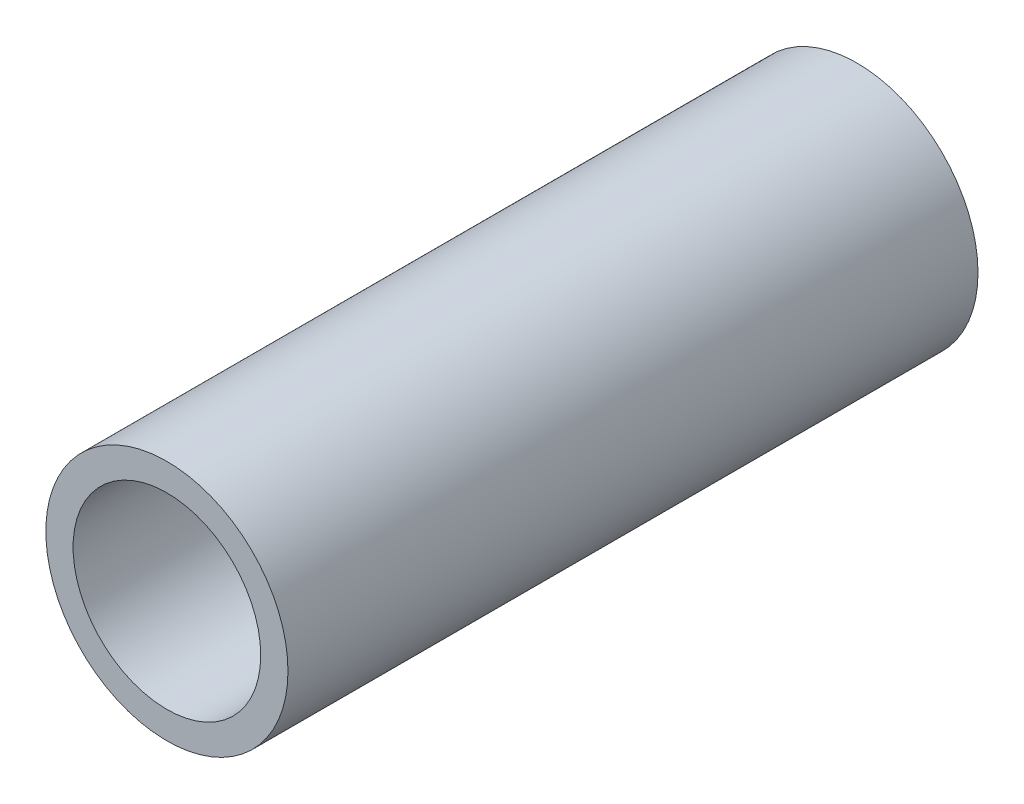
ISO-10303-21;
HEADER;
FILE_DESCRIPTION(('STEP AP214'),'2;1');
FILE_NAME('part.step','',(''),(''),'','','');
FILE_SCHEMA(('AUTOMOTIVE_DESIGN { 1 0 10303 214 1 1 1 1 }'));
ENDSEC;
DATA;
#1=APPLICATION_CONTEXT('core data for automotive mechanical design processes');
#2=APPLICATION_PROTOCOL_DEFINITION('international standard','automotive_design',2000,#1);
#3=PRODUCT_CONTEXT('',#1,'mechanical');
#4=PRODUCT('Part','Part','',(#3));
#5=PRODUCT_RELATED_PRODUCT_CATEGORY('part','',(#4));
#6=PRODUCT_DEFINITION_FORMATION('','',#4);
#7=PRODUCT_DEFINITION_CONTEXT('part definition',#1,'design');
#8=PRODUCT_DEFINITION('design','',#6,#7);
#9=PRODUCT_DEFINITION_SHAPE('','',#8);
#10=(LENGTH_UNIT() NAMED_UNIT(*) SI_UNIT(.MILLI.,.METRE.));
#11=(NAMED_UNIT(*) PLANE_ANGLE_UNIT() SI_UNIT($,.RADIAN.));
#12=(NAMED_UNIT(*) SI_UNIT($,.STERADIAN.) SOLID_ANGLE_UNIT());
#13=UNCERTAINTY_MEASURE_WITH_UNIT(LENGTH_MEASURE(1.E-05),#10,'distance_accuracy_value','');
#14=(GEOMETRIC_REPRESENTATION_CONTEXT(3) GLOBAL_UNCERTAINTY_ASSIGNED_CONTEXT((#13)) GLOBAL_UNIT_ASSIGNED_CONTEXT((#10,
#11,#12)) REPRESENTATION_CONTEXT('',''));
#15=CARTESIAN_POINT('',(0.,0.,0.));
#16=DIRECTION('',(0.,0.,1.));
#17=DIRECTION('',(1.,0.,0.));
#18=AXIS2_PLACEMENT_3D('',#15,#16,#17);
#19=CARTESIAN_POINT('',(0.,0.,5.7));
#20=DIRECTION('',(0.,0.,1.));
#21=DIRECTION('',(1.,0.,0.));
#22=AXIS2_PLACEMENT_3D('',#19,#20,#21);
#23=PLANE('',#22);
#24=CARTESIAN_POINT('',(0.,0.,5.7));
#25=DIRECTION('',(0.,0.,1.));
#26=DIRECTION('',(1.,0.,0.));
#27=AXIS2_PLACEMENT_3D('',#24,#25,#26);
#28=CIRCLE('',#27,1.);
#29=CARTESIAN_POINT('',(1.,0.,5.7));
#30=VERTEX_POINT('',#29);
#31=EDGE_CURVE('E10',#30,#30,#28,.T.);
#32=ORIENTED_EDGE('',*,*,#31,.T.);
#33=EDGE_LOOP('',(#32));
#34=FACE_BOUND('',#33,.T.);
#35=CARTESIAN_POINT('',(0.,0.,5.7));
#36=DIRECTION('',(0.,0.,1.));
#37=DIRECTION('',(1.,0.,0.));
#38=AXIS2_PLACEMENT_3D('',#35,#36,#37);
#39=CIRCLE('',#38,0.775);
#40=CARTESIAN_POINT('',(0.775,0.,5.7));
#41=VERTEX_POINT('',#40);
#42=EDGE_CURVE('E46',#41,#41,#39,.T.);
#43=ORIENTED_EDGE('',*,*,#42,.F.);
#44=EDGE_LOOP('',(#43));
#45=FACE_BOUND('',#44,.T.);
#46=ADVANCED_FACE('F35',(#34,#45),#23,.T.);
#47=CARTESIAN_POINT('',(0.,0.,0.));
#48=DIRECTION('',(0.,0.,1.));
#49=DIRECTION('',(1.,0.,0.));
#50=AXIS2_PLACEMENT_3D('',#47,#48,#49);
#51=PLANE('',#50);
#52=CARTESIAN_POINT('',(0.,0.,0.));
#53=DIRECTION('',(0.,0.,1.));
#54=DIRECTION('',(1.,0.,0.));
#55=AXIS2_PLACEMENT_3D('',#52,#53,#54);
#56=CIRCLE('',#55,1.);
#57=CARTESIAN_POINT('',(1.,0.,0.));
#58=VERTEX_POINT('',#57);
#59=EDGE_CURVE('E39',#58,#58,#56,.T.);
#60=ORIENTED_EDGE('',*,*,#59,.F.);
#61=EDGE_LOOP('',(#60));
#62=FACE_BOUND('',#61,.T.);
#63=CARTESIAN_POINT('',(0.,0.,0.));
#64=DIRECTION('',(0.,0.,1.));
#65=DIRECTION('',(1.,0.,0.));
#66=AXIS2_PLACEMENT_3D('',#63,#64,#65);
#67=CIRCLE('',#66,0.775);
#68=CARTESIAN_POINT('',(0.775,0.,0.));
#69=VERTEX_POINT('',#68);
#70=EDGE_CURVE('E48',#69,#69,#67,.T.);
#71=ORIENTED_EDGE('',*,*,#70,.T.);
#72=EDGE_LOOP('',(#71));
#73=FACE_BOUND('',#72,.T.);
#74=ADVANCED_FACE('F58',(#62,#73),#51,.F.);
#75=CARTESIAN_POINT('',(0.,0.,5.7));
#76=DIRECTION('',(0.,0.,-1.));
#77=DIRECTION('',(-1.,0.,0.));
#78=AXIS2_PLACEMENT_3D('',#75,#76,#77);
#79=CYLINDRICAL_SURFACE('',#78,1.);
#80=ORIENTED_EDGE('',*,*,#31,.F.);
#81=EDGE_LOOP('',(#80));
#82=FACE_BOUND('',#81,.T.);
#83=ORIENTED_EDGE('',*,*,#59,.T.);
#84=EDGE_LOOP('',(#83));
#85=FACE_BOUND('',#84,.T.);
#86=ADVANCED_FACE('F37',(#82,#85),#79,.T.);
#87=CARTESIAN_POINT('',(0.,0.,5.7));
#88=DIRECTION('',(0.,0.,-1.));
#89=DIRECTION('',(-1.,0.,0.));
#90=AXIS2_PLACEMENT_3D('',#87,#88,#89);
#91=CYLINDRICAL_SURFACE('',#90,0.775);
#92=ORIENTED_EDGE('',*,*,#42,.T.);
#93=EDGE_LOOP('',(#92));
#94=FACE_BOUND('',#93,.T.);
#95=ORIENTED_EDGE('',*,*,#70,.F.);
#96=EDGE_LOOP('',(#95));
#97=FACE_BOUND('',#96,.T.);
#98=ADVANCED_FACE('F54',(#94,#97),#91,.F.);
#99=CLOSED_SHELL('',(#46,#74,#86,#98));
#100=MANIFOLD_SOLID_BREP('B2',#99);
#101=ADVANCED_BREP_SHAPE_REPRESENTATION('',(#18,#100),#14);
#102=SHAPE_DEFINITION_REPRESENTATION(#9,#101);
ENDSEC;
END-ISO-10303-21;
